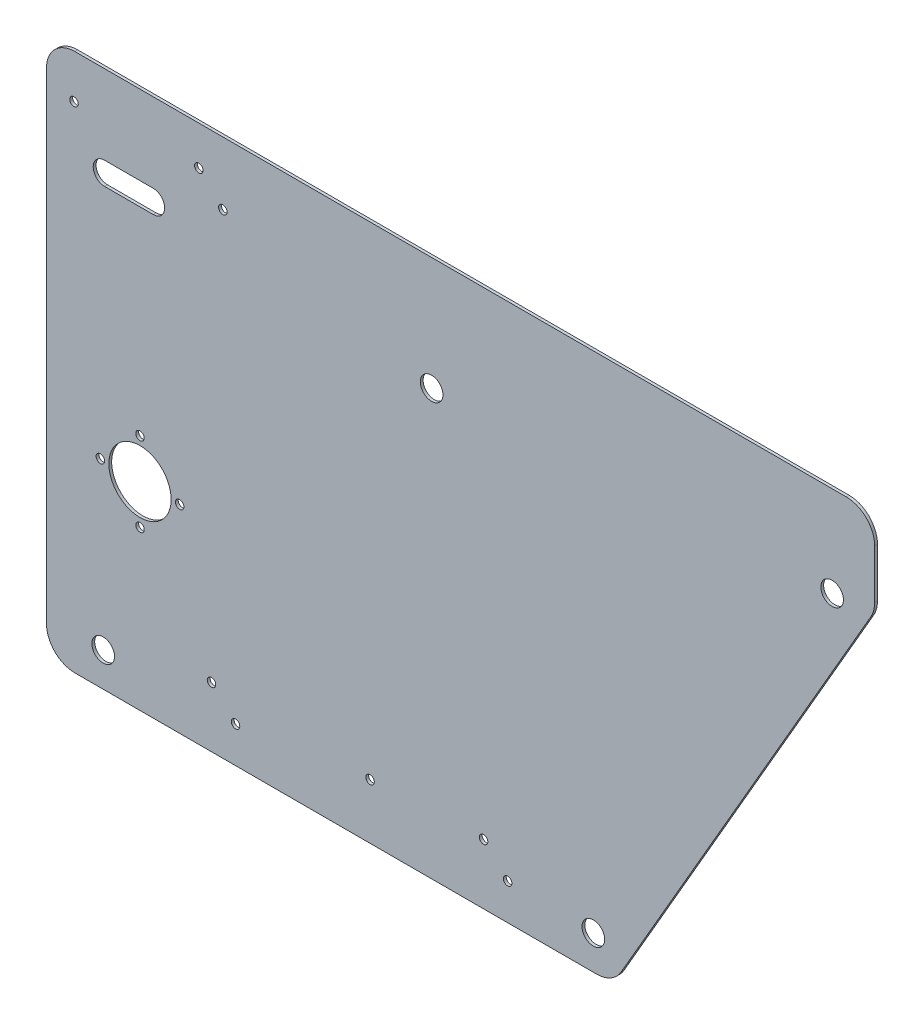
ISO-10303-21;
HEADER;
FILE_DESCRIPTION(('STEP AP214'),'2;1');
FILE_NAME('part.step','',(''),(''),'','','');
FILE_SCHEMA(('AUTOMOTIVE_DESIGN { 1 0 10303 214 1 1 1 1 }'));
ENDSEC;
DATA;
#1=APPLICATION_CONTEXT('core data for automotive mechanical design processes');
#2=APPLICATION_PROTOCOL_DEFINITION('international standard','automotive_design',2000,#1);
#3=PRODUCT_CONTEXT('',#1,'mechanical');
#4=PRODUCT('Part','Part','',(#3));
#5=PRODUCT_RELATED_PRODUCT_CATEGORY('part','',(#4));
#6=PRODUCT_DEFINITION_FORMATION('','',#4);
#7=PRODUCT_DEFINITION_CONTEXT('part definition',#1,'design');
#8=PRODUCT_DEFINITION('design','',#6,#7);
#9=PRODUCT_DEFINITION_SHAPE('','',#8);
#10=(LENGTH_UNIT() NAMED_UNIT(*) SI_UNIT(.MILLI.,.METRE.));
#11=(NAMED_UNIT(*) PLANE_ANGLE_UNIT() SI_UNIT($,.RADIAN.));
#12=(NAMED_UNIT(*) SI_UNIT($,.STERADIAN.) SOLID_ANGLE_UNIT());
#13=UNCERTAINTY_MEASURE_WITH_UNIT(LENGTH_MEASURE(1.E-05),#10,'distance_accuracy_value','');
#14=(GEOMETRIC_REPRESENTATION_CONTEXT(3) GLOBAL_UNCERTAINTY_ASSIGNED_CONTEXT((#13)) GLOBAL_UNIT_ASSIGNED_CONTEXT((#10,
#11,#12)) REPRESENTATION_CONTEXT('',''));
#15=CARTESIAN_POINT('',(0.,0.,0.));
#16=DIRECTION('',(0.,0.,1.));
#17=DIRECTION('',(1.,0.,0.));
#18=AXIS2_PLACEMENT_3D('',#15,#16,#17);
#19=CARTESIAN_POINT('',(0.,-80.0000000000001,1.));
#20=DIRECTION('',(0.,1.,0.));
#21=DIRECTION('',(0.,0.,1.));
#22=AXIS2_PLACEMENT_3D('',#19,#20,#21);
#23=PLANE('',#22);
#24=DIRECTION('',(1.,0.,0.));
#25=VECTOR('',#24,1.);
#26=CARTESIAN_POINT('',(0.,-80.0000000000001,0.));
#27=LINE('',#26,#25);
#28=CARTESIAN_POINT('',(-90.0000000000001,-80.0000000000001,0.));
#29=VERTEX_POINT('',#28);
#30=CARTESIAN_POINT('',(94.2264973081037,-80.0000000000001,0.));
#31=VERTEX_POINT('',#30);
#32=EDGE_CURVE('E234',#29,#31,#27,.T.);
#33=ORIENTED_EDGE('',*,*,#32,.T.);
#34=DIRECTION('',(0.,0.,-1.));
#35=VECTOR('',#34,1.);
#36=CARTESIAN_POINT('',(94.2264973081037,-80.0000000000001,1.));
#37=LINE('',#36,#35);
#38=CARTESIAN_POINT('',(94.2264973081037,-80.0000000000001,1.));
#39=VERTEX_POINT('',#38);
#40=EDGE_CURVE('E322',#31,#39,#37,.F.);
#41=ORIENTED_EDGE('',*,*,#40,.T.);
#42=DIRECTION('',(1.,0.,0.));
#43=VECTOR('',#42,1.);
#44=CARTESIAN_POINT('',(0.,-80.0000000000001,1.));
#45=LINE('',#44,#43);
#46=CARTESIAN_POINT('',(-90.0000000000001,-80.0000000000001,1.));
#47=VERTEX_POINT('',#46);
#48=EDGE_CURVE('E220',#47,#39,#45,.T.);
#49=ORIENTED_EDGE('',*,*,#48,.F.);
#50=DIRECTION('',(0.,0.,-1.));
#51=VECTOR('',#50,1.);
#52=CARTESIAN_POINT('',(-90.0000000000001,-80.0000000000001,0.));
#53=LINE('',#52,#51);
#54=EDGE_CURVE('E318',#47,#29,#53,.T.);
#55=ORIENTED_EDGE('',*,*,#54,.T.);
#56=EDGE_LOOP('',(#33,#41,#49,#55));
#57=FACE_BOUND('',#56,.T.);
#58=ADVANCED_FACE('F71',(#57),#23,.F.);
#59=CARTESIAN_POINT('',(109.641016151378,-63.3012701892212,1.));
#60=DIRECTION('',(0.866025403784442,-0.499999999999994,0.));
#61=DIRECTION('',(0.499999999999995,0.866025403784442,0.));
#62=AXIS2_PLACEMENT_3D('',#59,#60,#61);
#63=PLANE('',#62);
#64=DIRECTION('',(-0.499999999999995,-0.866025403784442,0.));
#65=VECTOR('',#64,1.);
#66=CARTESIAN_POINT('',(109.641016151378,-63.3012701892212,0.));
#67=LINE('',#66,#65);
#68=CARTESIAN_POINT('',(191.036297108183,77.6794919243112,0.));
#69=VERTEX_POINT('',#68);
#70=CARTESIAN_POINT('',(102.886751345948,-75.,0.));
#71=VERTEX_POINT('',#70);
#72=EDGE_CURVE('E238',#69,#71,#67,.T.);
#73=ORIENTED_EDGE('',*,*,#72,.F.);
#74=DIRECTION('',(0.,0.,-1.));
#75=VECTOR('',#74,1.);
#76=CARTESIAN_POINT('',(191.036297108183,77.6794919243112,1.));
#77=LINE('',#76,#75);
#78=CARTESIAN_POINT('',(191.036297108183,77.6794919243112,1.));
#79=VERTEX_POINT('',#78);
#80=EDGE_CURVE('E286',#69,#79,#77,.F.);
#81=ORIENTED_EDGE('',*,*,#80,.T.);
#82=DIRECTION('',(-0.499999999999995,-0.866025403784442,0.));
#83=VECTOR('',#82,1.);
#84=CARTESIAN_POINT('',(109.641016151378,-63.3012701892212,1.));
#85=LINE('',#84,#83);
#86=CARTESIAN_POINT('',(102.886751345948,-75.,1.));
#87=VERTEX_POINT('',#86);
#88=EDGE_CURVE('E224',#79,#87,#85,.T.);
#89=ORIENTED_EDGE('',*,*,#88,.T.);
#90=DIRECTION('',(0.,0.,-1.));
#91=VECTOR('',#90,1.);
#92=CARTESIAN_POINT('',(102.886751345948,-75.,0.));
#93=LINE('',#92,#91);
#94=EDGE_CURVE('E282',#87,#71,#93,.T.);
#95=ORIENTED_EDGE('',*,*,#94,.T.);
#96=EDGE_LOOP('',(#73,#81,#89,#95));
#97=FACE_BOUND('',#96,.T.);
#98=ADVANCED_FACE('F459',(#97),#63,.T.);
#99=CARTESIAN_POINT('',(-100.,0.,1.));
#100=DIRECTION('',(-1.,0.,0.));
#101=DIRECTION('',(0.,0.,1.));
#102=AXIS2_PLACEMENT_3D('',#99,#100,#101);
#103=PLANE('',#102);
#104=DIRECTION('',(0.,1.,0.));
#105=VECTOR('',#104,1.);
#106=CARTESIAN_POINT('',(-100.,0.,1.));
#107=LINE('',#106,#105);
#108=CARTESIAN_POINT('',(-100.,-70.0000000000001,1.));
#109=VERTEX_POINT('',#108);
#110=CARTESIAN_POINT('',(-100.,100.,1.));
#111=VERTEX_POINT('',#110);
#112=EDGE_CURVE('E229',#109,#111,#107,.T.);
#113=ORIENTED_EDGE('',*,*,#112,.T.);
#114=DIRECTION('',(0.,0.,-1.));
#115=VECTOR('',#114,1.);
#116=CARTESIAN_POINT('',(-100.,100.,1.));
#117=LINE('',#116,#115);
#118=CARTESIAN_POINT('',(-100.,100.,0.));
#119=VERTEX_POINT('',#118);
#120=EDGE_CURVE('E314',#111,#119,#117,.T.);
#121=ORIENTED_EDGE('',*,*,#120,.T.);
#122=DIRECTION('',(0.,1.,0.));
#123=VECTOR('',#122,1.);
#124=CARTESIAN_POINT('',(-100.,0.,0.));
#125=LINE('',#124,#123);
#126=CARTESIAN_POINT('',(-100.,-70.0000000000001,0.));
#127=VERTEX_POINT('',#126);
#128=EDGE_CURVE('E225',#127,#119,#125,.T.);
#129=ORIENTED_EDGE('',*,*,#128,.F.);
#130=DIRECTION('',(0.,0.,-1.));
#131=VECTOR('',#130,1.);
#132=CARTESIAN_POINT('',(-100.,-70.0000000000001,1.));
#133=LINE('',#132,#131);
#134=EDGE_CURVE('E311',#127,#109,#133,.F.);
#135=ORIENTED_EDGE('',*,*,#134,.T.);
#136=EDGE_LOOP('',(#113,#121,#129,#135));
#137=FACE_BOUND('',#136,.T.);
#138=ADVANCED_FACE('F475',(#137),#103,.T.);
#139=CARTESIAN_POINT('',(0.,0.,1.));
#140=DIRECTION('',(0.,0.,1.));
#141=DIRECTION('',(1.,0.,0.));
#142=AXIS2_PLACEMENT_3D('',#139,#140,#141);
#143=PLANE('',#142);
#144=CARTESIAN_POINT('',(-90.2956271146875,94.4999999999995,1.));
#145=DIRECTION('',(0.,0.,1.));
#146=DIRECTION('',(1.,0.,0.));
#147=AXIS2_PLACEMENT_3D('',#144,#145,#146);
#148=CIRCLE('',#147,1.5);
#149=CARTESIAN_POINT('',(-88.7956271146875,94.4999999999995,1.));
#150=VERTEX_POINT('',#149);
#151=EDGE_CURVE('E209',#150,#150,#148,.T.);
#152=ORIENTED_EDGE('',*,*,#151,.F.);
#153=EDGE_LOOP('',(#152));
#154=FACE_BOUND('',#153,.T.);
#155=CARTESIAN_POINT('',(-80.0000000000001,-68.0000000000001,1.));
#156=DIRECTION('',(0.,0.,1.));
#157=DIRECTION('',(1.,0.,0.));
#158=AXIS2_PLACEMENT_3D('',#155,#156,#157);
#159=CIRCLE('',#158,4.00000000000002);
#160=CARTESIAN_POINT('',(-76.,-68.0000000000001,1.));
#161=VERTEX_POINT('',#160);
#162=EDGE_CURVE('E181',#161,#161,#159,.T.);
#163=ORIENTED_EDGE('',*,*,#162,.F.);
#164=EDGE_LOOP('',(#163));
#165=FACE_BOUND('',#164,.T.);
#166=CARTESIAN_POINT('',(-53.0000000000001,-10.,1.));
#167=DIRECTION('',(0.,0.,1.));
#168=DIRECTION('',(1.,0.,0.));
#169=AXIS2_PLACEMENT_3D('',#166,#167,#168);
#170=CIRCLE('',#169,1.5);
#171=CARTESIAN_POINT('',(-51.5000000000001,-10.,1.));
#172=VERTEX_POINT('',#171);
#173=EDGE_CURVE('E883',#172,#172,#170,.T.);
#174=ORIENTED_EDGE('',*,*,#173,.F.);
#175=EDGE_LOOP('',(#174));
#176=FACE_BOUND('',#175,.T.);
#177=CARTESIAN_POINT('',(-67.0000000000001,3.99999999999995,1.));
#178=DIRECTION('',(0.,0.,1.));
#179=DIRECTION('',(1.,0.,0.));
#180=AXIS2_PLACEMENT_3D('',#177,#178,#179);
#181=CIRCLE('',#180,1.5);
#182=CARTESIAN_POINT('',(-65.5000000000001,3.99999999999995,1.));
#183=VERTEX_POINT('',#182);
#184=EDGE_CURVE('E879',#183,#183,#181,.T.);
#185=ORIENTED_EDGE('',*,*,#184,.F.);
#186=EDGE_LOOP('',(#185));
#187=FACE_BOUND('',#186,.T.);
#188=CARTESIAN_POINT('',(-81.0000000000001,-10.,1.));
#189=DIRECTION('',(0.,0.,1.));
#190=DIRECTION('',(1.,0.,0.));
#191=AXIS2_PLACEMENT_3D('',#188,#189,#190);
#192=CIRCLE('',#191,1.5);
#193=CARTESIAN_POINT('',(-79.5000000000001,-10.,1.));
#194=VERTEX_POINT('',#193);
#195=EDGE_CURVE('E871',#194,#194,#192,.T.);
#196=ORIENTED_EDGE('',*,*,#195,.F.);
#197=EDGE_LOOP('',(#196));
#198=FACE_BOUND('',#197,.T.);
#199=CARTESIAN_POINT('',(-79.5165867727854,77.9999999999999,1.));
#200=DIRECTION('',(0.,0.,1.));
#201=DIRECTION('',(1.,0.,0.));
#202=AXIS2_PLACEMENT_3D('',#199,#200,#201);
#203=CIRCLE('',#202,4.00000000000002);
#204=CARTESIAN_POINT('',(-79.5165867727854,82.,1.));
#205=VERTEX_POINT('',#204);
#206=CARTESIAN_POINT('',(-79.5165867727854,73.9999999999999,1.));
#207=VERTEX_POINT('',#206);
#208=EDGE_CURVE('E89',#205,#207,#203,.T.);
#209=ORIENTED_EDGE('',*,*,#208,.F.);
#210=DIRECTION('',(-1.,0.,0.));
#211=VECTOR('',#210,1.);
#212=CARTESIAN_POINT('',(-79.5165867727854,82.,1.));
#213=LINE('',#212,#211);
#214=CARTESIAN_POINT('',(-62.3003333743354,82.,1.));
#215=VERTEX_POINT('',#214);
#216=EDGE_CURVE('E184',#215,#205,#213,.T.);
#217=ORIENTED_EDGE('',*,*,#216,.F.);
#218=CARTESIAN_POINT('',(-62.3003333743354,77.9999999999999,1.));
#219=DIRECTION('',(0.,0.,1.));
#220=DIRECTION('',(1.,0.,0.));
#221=AXIS2_PLACEMENT_3D('',#218,#219,#220);
#222=CIRCLE('',#221,4.00000000000002);
#223=CARTESIAN_POINT('',(-62.3003333743354,73.9999999999999,1.));
#224=VERTEX_POINT('',#223);
#225=EDGE_CURVE('E191',#224,#215,#222,.T.);
#226=ORIENTED_EDGE('',*,*,#225,.F.);
#227=DIRECTION('',(1.,0.,0.));
#228=VECTOR('',#227,1.);
#229=CARTESIAN_POINT('',(-79.5165867727854,73.9999999999999,1.));
#230=LINE('',#229,#228);
#231=EDGE_CURVE('E197',#207,#224,#230,.T.);
#232=ORIENTED_EDGE('',*,*,#231,.F.);
#233=EDGE_LOOP('',(#209,#217,#226,#232));
#234=FACE_BOUND('',#233,.T.);
#235=CARTESIAN_POINT('',(-67.0000000000001,-10.,1.));
#236=DIRECTION('',(0.,0.,1.));
#237=DIRECTION('',(1.,0.,0.));
#238=AXIS2_PLACEMENT_3D('',#235,#236,#237);
#239=CIRCLE('',#238,11.);
#240=CARTESIAN_POINT('',(-56.0000000000001,-10.,1.));
#241=VERTEX_POINT('',#240);
#242=EDGE_CURVE('E199',#241,#241,#239,.T.);
#243=ORIENTED_EDGE('',*,*,#242,.F.);
#244=EDGE_LOOP('',(#243));
#245=FACE_BOUND('',#244,.T.);
#246=CARTESIAN_POINT('',(62.7960575902142,-67.2426406871193,1.));
#247=DIRECTION('',(0.,0.,1.));
#248=DIRECTION('',(1.,0.,0.));
#249=AXIS2_PLACEMENT_3D('',#246,#247,#248);
#250=CIRCLE('',#249,1.5);
#251=CARTESIAN_POINT('',(64.2960575902142,-67.2426406871193,1.));
#252=VERTEX_POINT('',#251);
#253=EDGE_CURVE('E204',#252,#252,#250,.T.);
#254=ORIENTED_EDGE('',*,*,#253,.F.);
#255=EDGE_LOOP('',(#254));
#256=FACE_BOUND('',#255,.T.);
#257=CARTESIAN_POINT('',(177.364936071409,77.9999999999999,1.));
#258=DIRECTION('',(0.,0.,1.));
#259=DIRECTION('',(1.,0.,0.));
#260=AXIS2_PLACEMENT_3D('',#257,#258,#259);
#261=CIRCLE('',#260,3.99999999999999);
#262=CARTESIAN_POINT('',(181.364936071409,77.9999999999999,1.));
#263=VERTEX_POINT('',#262);
#264=EDGE_CURVE('E219',#263,#263,#261,.T.);
#265=ORIENTED_EDGE('',*,*,#264,.F.);
#266=EDGE_LOOP('',(#265));
#267=FACE_BOUND('',#266,.T.);
#268=CARTESIAN_POINT('',(-46.2399918128805,96.2426406871192,1.));
#269=DIRECTION('',(0.,0.,1.));
#270=DIRECTION('',(1.,0.,0.));
#271=AXIS2_PLACEMENT_3D('',#268,#269,#270);
#272=CIRCLE('',#271,1.5);
#273=CARTESIAN_POINT('',(-44.7399918128805,96.2426406871192,1.));
#274=VERTEX_POINT('',#273);
#275=EDGE_CURVE('E213',#274,#274,#272,.T.);
#276=ORIENTED_EDGE('',*,*,#275,.F.);
#277=EDGE_LOOP('',(#276));
#278=FACE_BOUND('',#277,.T.);
#279=CARTESIAN_POINT('',(-37.754710438642,87.7573593128807,1.));
#280=DIRECTION('',(0.,0.,1.));
#281=DIRECTION('',(1.,0.,0.));
#282=AXIS2_PLACEMENT_3D('',#279,#280,#281);
#283=CIRCLE('',#282,1.5);
#284=CARTESIAN_POINT('',(-36.254710438642,87.7573593128807,1.));
#285=VERTEX_POINT('',#284);
#286=EDGE_CURVE('E859',#285,#285,#283,.T.);
#287=ORIENTED_EDGE('',*,*,#286,.F.);
#288=EDGE_LOOP('',(#287));
#289=FACE_BOUND('',#288,.T.);
#290=CARTESIAN_POINT('',(14.2258557289781,-60.5000000000005,1.));
#291=DIRECTION('',(0.,0.,1.));
#292=DIRECTION('',(1.,0.,0.));
#293=AXIS2_PLACEMENT_3D('',#290,#291,#292);
#294=CIRCLE('',#293,1.5);
#295=CARTESIAN_POINT('',(15.7258557289781,-60.5000000000005,1.));
#296=VERTEX_POINT('',#295);
#297=EDGE_CURVE('E851',#296,#296,#294,.T.);
#298=ORIENTED_EDGE('',*,*,#297,.F.);
#299=EDGE_LOOP('',(#298));
#300=FACE_BOUND('',#299,.T.);
#301=CARTESIAN_POINT('',(-41.7595083099343,-58.7573593128808,1.));
#302=DIRECTION('',(0.,0.,1.));
#303=DIRECTION('',(1.,0.,0.));
#304=AXIS2_PLACEMENT_3D('',#301,#302,#303);
#305=CIRCLE('',#304,1.50000000000001);
#306=CARTESIAN_POINT('',(-40.2595083099343,-58.7573593128808,1.));
#307=VERTEX_POINT('',#306);
#308=EDGE_CURVE('E834',#307,#307,#305,.T.);
#309=ORIENTED_EDGE('',*,*,#308,.F.);
#310=EDGE_LOOP('',(#309));
#311=FACE_BOUND('',#310,.T.);
#312=CARTESIAN_POINT('',(-33.2742269356957,-67.2426406871193,1.));
#313=DIRECTION('',(0.,0.,1.));
#314=DIRECTION('',(1.,0.,0.));
#315=AXIS2_PLACEMENT_3D('',#312,#313,#314);
#316=CIRCLE('',#315,1.5);
#317=CARTESIAN_POINT('',(-31.7742269356957,-67.2426406871193,1.));
#318=VERTEX_POINT('',#317);
#319=EDGE_CURVE('E850',#318,#318,#316,.T.);
#320=ORIENTED_EDGE('',*,*,#319,.F.);
#321=EDGE_LOOP('',(#320));
#322=FACE_BOUND('',#321,.T.);
#323=CARTESIAN_POINT('',(54.3107762159756,-58.7573593128808,1.));
#324=DIRECTION('',(0.,0.,1.));
#325=DIRECTION('',(1.,0.,0.));
#326=AXIS2_PLACEMENT_3D('',#323,#324,#325);
#327=CIRCLE('',#326,1.50000000000001);
#328=CARTESIAN_POINT('',(55.8107762159756,-58.7573593128808,1.));
#329=VERTEX_POINT('',#328);
#330=EDGE_CURVE('E856',#329,#329,#327,.T.);
#331=ORIENTED_EDGE('',*,*,#330,.F.);
#332=EDGE_LOOP('',(#331));
#333=FACE_BOUND('',#332,.T.);
#334=CARTESIAN_POINT('',(35.9572650330467,70.,1.));
#335=DIRECTION('',(0.,0.,1.));
#336=DIRECTION('',(1.,0.,0.));
#337=AXIS2_PLACEMENT_3D('',#334,#335,#336);
#338=CIRCLE('',#337,4.00000000000001);
#339=CARTESIAN_POINT('',(39.9572650330467,70.,1.));
#340=VERTEX_POINT('',#339);
#341=EDGE_CURVE('E872',#340,#340,#338,.T.);
#342=ORIENTED_EDGE('',*,*,#341,.F.);
#343=EDGE_LOOP('',(#342));
#344=FACE_BOUND('',#343,.T.);
#345=CARTESIAN_POINT('',(-67.0000000000001,-24.,1.));
#346=DIRECTION('',(0.,0.,1.));
#347=DIRECTION('',(1.,0.,0.));
#348=AXIS2_PLACEMENT_3D('',#345,#346,#347);
#349=CIRCLE('',#348,1.5);
#350=CARTESIAN_POINT('',(-65.5000000000001,-24.,1.));
#351=VERTEX_POINT('',#350);
#352=EDGE_CURVE('E868',#351,#351,#349,.T.);
#353=ORIENTED_EDGE('',*,*,#352,.F.);
#354=EDGE_LOOP('',(#353));
#355=FACE_BOUND('',#354,.T.);
#356=CARTESIAN_POINT('',(93.0717967697233,-68.0000000000001,1.));
#357=DIRECTION('',(0.,0.,1.));
#358=DIRECTION('',(1.,0.,0.));
#359=AXIS2_PLACEMENT_3D('',#356,#357,#358);
#360=CIRCLE('',#359,4.00000000000001);
#361=CARTESIAN_POINT('',(97.0717967697233,-68.0000000000001,1.));
#362=VERTEX_POINT('',#361);
#363=EDGE_CURVE('E214',#362,#362,#360,.T.);
#364=ORIENTED_EDGE('',*,*,#363,.F.);
#365=EDGE_LOOP('',(#364));
#366=FACE_BOUND('',#365,.T.);
#367=ORIENTED_EDGE('',*,*,#88,.F.);
#368=CARTESIAN_POINT('',(182.376043070339,82.6794919243112,1.));
#369=DIRECTION('',(0.,0.,1.));
#370=DIRECTION('',(1.,0.,0.));
#371=AXIS2_PLACEMENT_3D('',#368,#369,#370);
#372=CIRCLE('',#371,10.);
#373=CARTESIAN_POINT('',(192.376043070339,82.6794919243112,1.));
#374=VERTEX_POINT('',#373);
#375=EDGE_CURVE('E301',#79,#374,#372,.T.);
#376=ORIENTED_EDGE('',*,*,#375,.T.);
#377=DIRECTION('',(0.,1.,0.));
#378=VECTOR('',#377,1.);
#379=CARTESIAN_POINT('',(192.376043070339,80.,1.));
#380=LINE('',#379,#378);
#381=CARTESIAN_POINT('',(192.376043070339,100.,1.));
#382=VERTEX_POINT('',#381);
#383=EDGE_CURVE('E239',#374,#382,#380,.T.);
#384=ORIENTED_EDGE('',*,*,#383,.T.);
#385=CARTESIAN_POINT('',(182.376043070339,100.,1.));
#386=DIRECTION('',(0.,0.,1.));
#387=DIRECTION('',(1.,0.,0.));
#388=AXIS2_PLACEMENT_3D('',#385,#386,#387);
#389=CIRCLE('',#388,10.);
#390=CARTESIAN_POINT('',(182.376043070339,110.,1.));
#391=VERTEX_POINT('',#390);
#392=EDGE_CURVE('E298',#382,#391,#389,.T.);
#393=ORIENTED_EDGE('',*,*,#392,.T.);
#394=DIRECTION('',(1.,0.,0.));
#395=VECTOR('',#394,1.);
#396=CARTESIAN_POINT('',(-100.,110.,1.));
#397=LINE('',#396,#395);
#398=CARTESIAN_POINT('',(-90.0000000000001,110.,1.));
#399=VERTEX_POINT('',#398);
#400=EDGE_CURVE('E246',#399,#391,#397,.T.);
#401=ORIENTED_EDGE('',*,*,#400,.F.);
#402=CARTESIAN_POINT('',(-90.0000000000001,100.,1.));
#403=DIRECTION('',(0.,0.,1.));
#404=DIRECTION('',(1.,0.,0.));
#405=AXIS2_PLACEMENT_3D('',#402,#403,#404);
#406=CIRCLE('',#405,10.);
#407=EDGE_CURVE('E295',#399,#111,#406,.T.);
#408=ORIENTED_EDGE('',*,*,#407,.T.);
#409=ORIENTED_EDGE('',*,*,#112,.F.);
#410=CARTESIAN_POINT('',(-90.0000000000001,-70.0000000000001,1.));
#411=DIRECTION('',(0.,0.,1.));
#412=DIRECTION('',(1.,0.,0.));
#413=AXIS2_PLACEMENT_3D('',#410,#411,#412);
#414=CIRCLE('',#413,10.);
#415=EDGE_CURVE('E289',#109,#47,#414,.T.);
#416=ORIENTED_EDGE('',*,*,#415,.T.);
#417=ORIENTED_EDGE('',*,*,#48,.T.);
#418=CARTESIAN_POINT('',(94.2264973081037,-70.0000000000001,1.));
#419=DIRECTION('',(0.,0.,1.));
#420=DIRECTION('',(1.,0.,0.));
#421=AXIS2_PLACEMENT_3D('',#418,#419,#420);
#422=CIRCLE('',#421,10.);
#423=EDGE_CURVE('E292',#39,#87,#422,.T.);
#424=ORIENTED_EDGE('',*,*,#423,.T.);
#425=EDGE_LOOP('',(#367,#376,#384,#393,#401,#408,#409,#416,#417,#424));
#426=FACE_BOUND('',#425,.T.);
#427=ADVANCED_FACE('F195',(#154,#165,#176,#187,#198,#234,#245,#256,#267,#278,#289,#300,#311,
#322,#333,#344,#355,#366,#426),#143,.T.);
#428=CARTESIAN_POINT('',(0.,0.,0.));
#429=DIRECTION('',(0.,0.,1.));
#430=DIRECTION('',(1.,0.,0.));
#431=AXIS2_PLACEMENT_3D('',#428,#429,#430);
#432=PLANE('',#431);
#433=CARTESIAN_POINT('',(-90.2956271146875,94.4999999999995,0.));
#434=DIRECTION('',(0.,0.,1.));
#435=DIRECTION('',(1.,0.,0.));
#436=AXIS2_PLACEMENT_3D('',#433,#434,#435);
#437=CIRCLE('',#436,1.5);
#438=CARTESIAN_POINT('',(-88.7956271146875,94.4999999999995,0.));
#439=VERTEX_POINT('',#438);
#440=EDGE_CURVE('E75',#439,#439,#437,.T.);
#441=ORIENTED_EDGE('',*,*,#440,.T.);
#442=EDGE_LOOP('',(#441));
#443=FACE_BOUND('',#442,.T.);
#444=CARTESIAN_POINT('',(-80.0000000000001,-68.0000000000001,0.));
#445=DIRECTION('',(0.,0.,1.));
#446=DIRECTION('',(1.,0.,0.));
#447=AXIS2_PLACEMENT_3D('',#444,#445,#446);
#448=CIRCLE('',#447,4.00000000000002);
#449=CARTESIAN_POINT('',(-76.,-68.0000000000001,0.));
#450=VERTEX_POINT('',#449);
#451=EDGE_CURVE('E393',#450,#450,#448,.T.);
#452=ORIENTED_EDGE('',*,*,#451,.T.);
#453=EDGE_LOOP('',(#452));
#454=FACE_BOUND('',#453,.T.);
#455=CARTESIAN_POINT('',(-53.0000000000001,-10.,0.));
#456=DIRECTION('',(0.,0.,1.));
#457=DIRECTION('',(1.,0.,0.));
#458=AXIS2_PLACEMENT_3D('',#455,#456,#457);
#459=CIRCLE('',#458,1.5);
#460=CARTESIAN_POINT('',(-51.5000000000001,-10.,0.));
#461=VERTEX_POINT('',#460);
#462=EDGE_CURVE('E390',#461,#461,#459,.T.);
#463=ORIENTED_EDGE('',*,*,#462,.T.);
#464=EDGE_LOOP('',(#463));
#465=FACE_BOUND('',#464,.T.);
#466=CARTESIAN_POINT('',(-67.0000000000001,3.99999999999995,0.));
#467=DIRECTION('',(0.,0.,1.));
#468=DIRECTION('',(1.,0.,0.));
#469=AXIS2_PLACEMENT_3D('',#466,#467,#468);
#470=CIRCLE('',#469,1.5);
#471=CARTESIAN_POINT('',(-65.5000000000001,3.99999999999995,0.));
#472=VERTEX_POINT('',#471);
#473=EDGE_CURVE('E386',#472,#472,#470,.T.);
#474=ORIENTED_EDGE('',*,*,#473,.T.);
#475=EDGE_LOOP('',(#474));
#476=FACE_BOUND('',#475,.T.);
#477=CARTESIAN_POINT('',(-81.0000000000001,-10.,0.));
#478=DIRECTION('',(0.,0.,1.));
#479=DIRECTION('',(1.,0.,0.));
#480=AXIS2_PLACEMENT_3D('',#477,#478,#479);
#481=CIRCLE('',#480,1.5);
#482=CARTESIAN_POINT('',(-79.5000000000001,-10.,0.));
#483=VERTEX_POINT('',#482);
#484=EDGE_CURVE('E373',#483,#483,#481,.T.);
#485=ORIENTED_EDGE('',*,*,#484,.T.);
#486=EDGE_LOOP('',(#485));
#487=FACE_BOUND('',#486,.T.);
#488=DIRECTION('',(-1.,0.,0.));
#489=VECTOR('',#488,1.);
#490=CARTESIAN_POINT('',(0.,82.,0.));
#491=LINE('',#490,#489);
#492=CARTESIAN_POINT('',(-62.3003333743354,82.,0.));
#493=VERTEX_POINT('',#492);
#494=CARTESIAN_POINT('',(-79.5165867727854,82.,0.));
#495=VERTEX_POINT('',#494);
#496=EDGE_CURVE('E81',#493,#495,#491,.T.);
#497=ORIENTED_EDGE('',*,*,#496,.T.);
#498=CARTESIAN_POINT('',(-79.5165867727854,77.9999999999999,0.));
#499=DIRECTION('',(0.,0.,1.));
#500=DIRECTION('',(1.,0.,0.));
#501=AXIS2_PLACEMENT_3D('',#498,#499,#500);
#502=CIRCLE('',#501,4.00000000000002);
#503=CARTESIAN_POINT('',(-79.5165867727854,73.9999999999999,0.));
#504=VERTEX_POINT('',#503);
#505=EDGE_CURVE('E12',#495,#504,#502,.T.);
#506=ORIENTED_EDGE('',*,*,#505,.T.);
#507=DIRECTION('',(1.,0.,0.));
#508=VECTOR('',#507,1.);
#509=CARTESIAN_POINT('',(0.,73.9999999999999,0.));
#510=LINE('',#509,#508);
#511=CARTESIAN_POINT('',(-62.3003333743354,73.9999999999999,0.));
#512=VERTEX_POINT('',#511);
#513=EDGE_CURVE('E325',#504,#512,#510,.T.);
#514=ORIENTED_EDGE('',*,*,#513,.T.);
#515=CARTESIAN_POINT('',(-62.3003333743354,77.9999999999999,0.));
#516=DIRECTION('',(0.,0.,1.));
#517=DIRECTION('',(1.,0.,0.));
#518=AXIS2_PLACEMENT_3D('',#515,#516,#517);
#519=CIRCLE('',#518,4.00000000000002);
#520=EDGE_CURVE('E377',#512,#493,#519,.T.);
#521=ORIENTED_EDGE('',*,*,#520,.T.);
#522=EDGE_LOOP('',(#497,#506,#514,#521));
#523=FACE_BOUND('',#522,.T.);
#524=CARTESIAN_POINT('',(-67.0000000000001,-10.,0.));
#525=DIRECTION('',(0.,0.,1.));
#526=DIRECTION('',(1.,0.,0.));
#527=AXIS2_PLACEMENT_3D('',#524,#525,#526);
#528=CIRCLE('',#527,11.);
#529=CARTESIAN_POINT('',(-56.0000000000001,-10.,0.));
#530=VERTEX_POINT('',#529);
#531=EDGE_CURVE('E369',#530,#530,#528,.T.);
#532=ORIENTED_EDGE('',*,*,#531,.T.);
#533=EDGE_LOOP('',(#532));
#534=FACE_BOUND('',#533,.T.);
#535=CARTESIAN_POINT('',(62.7960575902142,-67.2426406871193,0.));
#536=DIRECTION('',(0.,0.,1.));
#537=DIRECTION('',(1.,0.,0.));
#538=AXIS2_PLACEMENT_3D('',#535,#536,#537);
#539=CIRCLE('',#538,1.5);
#540=CARTESIAN_POINT('',(64.2960575902142,-67.2426406871193,0.));
#541=VERTEX_POINT('',#540);
#542=EDGE_CURVE('E365',#541,#541,#539,.T.);
#543=ORIENTED_EDGE('',*,*,#542,.T.);
#544=EDGE_LOOP('',(#543));
#545=FACE_BOUND('',#544,.T.);
#546=CARTESIAN_POINT('',(177.364936071409,77.9999999999999,0.));
#547=DIRECTION('',(0.,0.,1.));
#548=DIRECTION('',(1.,0.,0.));
#549=AXIS2_PLACEMENT_3D('',#546,#547,#548);
#550=CIRCLE('',#549,3.99999999999999);
#551=CARTESIAN_POINT('',(181.364936071409,77.9999999999999,0.));
#552=VERTEX_POINT('',#551);
#553=EDGE_CURVE('E361',#552,#552,#550,.T.);
#554=ORIENTED_EDGE('',*,*,#553,.T.);
#555=EDGE_LOOP('',(#554));
#556=FACE_BOUND('',#555,.T.);
#557=CARTESIAN_POINT('',(-46.2399918128805,96.2426406871192,0.));
#558=DIRECTION('',(0.,0.,1.));
#559=DIRECTION('',(1.,0.,0.));
#560=AXIS2_PLACEMENT_3D('',#557,#558,#559);
#561=CIRCLE('',#560,1.5);
#562=CARTESIAN_POINT('',(-44.7399918128805,96.2426406871192,0.));
#563=VERTEX_POINT('',#562);
#564=EDGE_CURVE('E357',#563,#563,#561,.T.);
#565=ORIENTED_EDGE('',*,*,#564,.T.);
#566=EDGE_LOOP('',(#565));
#567=FACE_BOUND('',#566,.T.);
#568=CARTESIAN_POINT('',(-37.754710438642,87.7573593128807,0.));
#569=DIRECTION('',(0.,0.,1.));
#570=DIRECTION('',(1.,0.,0.));
#571=AXIS2_PLACEMENT_3D('',#568,#569,#570);
#572=CIRCLE('',#571,1.5);
#573=CARTESIAN_POINT('',(-36.254710438642,87.7573593128807,0.));
#574=VERTEX_POINT('',#573);
#575=EDGE_CURVE('E353',#574,#574,#572,.T.);
#576=ORIENTED_EDGE('',*,*,#575,.T.);
#577=EDGE_LOOP('',(#576));
#578=FACE_BOUND('',#577,.T.);
#579=CARTESIAN_POINT('',(14.2258557289781,-60.5000000000005,0.));
#580=DIRECTION('',(0.,0.,1.));
#581=DIRECTION('',(1.,0.,0.));
#582=AXIS2_PLACEMENT_3D('',#579,#580,#581);
#583=CIRCLE('',#582,1.5);
#584=CARTESIAN_POINT('',(15.7258557289781,-60.5000000000005,0.));
#585=VERTEX_POINT('',#584);
#586=EDGE_CURVE('E349',#585,#585,#583,.T.);
#587=ORIENTED_EDGE('',*,*,#586,.T.);
#588=EDGE_LOOP('',(#587));
#589=FACE_BOUND('',#588,.T.);
#590=CARTESIAN_POINT('',(-41.7595083099343,-58.7573593128808,0.));
#591=DIRECTION('',(0.,0.,1.));
#592=DIRECTION('',(1.,0.,0.));
#593=AXIS2_PLACEMENT_3D('',#590,#591,#592);
#594=CIRCLE('',#593,1.50000000000001);
#595=CARTESIAN_POINT('',(-40.2595083099343,-58.7573593128808,0.));
#596=VERTEX_POINT('',#595);
#597=EDGE_CURVE('E345',#596,#596,#594,.T.);
#598=ORIENTED_EDGE('',*,*,#597,.T.);
#599=EDGE_LOOP('',(#598));
#600=FACE_BOUND('',#599,.T.);
#601=CARTESIAN_POINT('',(-33.2742269356957,-67.2426406871193,0.));
#602=DIRECTION('',(0.,0.,1.));
#603=DIRECTION('',(1.,0.,0.));
#604=AXIS2_PLACEMENT_3D('',#601,#602,#603);
#605=CIRCLE('',#604,1.5);
#606=CARTESIAN_POINT('',(-31.7742269356957,-67.2426406871193,0.));
#607=VERTEX_POINT('',#606);
#608=EDGE_CURVE('E341',#607,#607,#605,.T.);
#609=ORIENTED_EDGE('',*,*,#608,.T.);
#610=EDGE_LOOP('',(#609));
#611=FACE_BOUND('',#610,.T.);
#612=CARTESIAN_POINT('',(54.3107762159756,-58.7573593128808,0.));
#613=DIRECTION('',(0.,0.,1.));
#614=DIRECTION('',(1.,0.,0.));
#615=AXIS2_PLACEMENT_3D('',#612,#613,#614);
#616=CIRCLE('',#615,1.50000000000001);
#617=CARTESIAN_POINT('',(55.8107762159756,-58.7573593128808,0.));
#618=VERTEX_POINT('',#617);
#619=EDGE_CURVE('E337',#618,#618,#616,.T.);
#620=ORIENTED_EDGE('',*,*,#619,.T.);
#621=EDGE_LOOP('',(#620));
#622=FACE_BOUND('',#621,.T.);
#623=CARTESIAN_POINT('',(35.9572650330467,70.,0.));
#624=DIRECTION('',(0.,0.,1.));
#625=DIRECTION('',(1.,0.,0.));
#626=AXIS2_PLACEMENT_3D('',#623,#624,#625);
#627=CIRCLE('',#626,4.00000000000001);
#628=CARTESIAN_POINT('',(39.9572650330467,70.,0.));
#629=VERTEX_POINT('',#628);
#630=EDGE_CURVE('E333',#629,#629,#627,.T.);
#631=ORIENTED_EDGE('',*,*,#630,.T.);
#632=EDGE_LOOP('',(#631));
#633=FACE_BOUND('',#632,.T.);
#634=CARTESIAN_POINT('',(-67.0000000000001,-24.,0.));
#635=DIRECTION('',(0.,0.,1.));
#636=DIRECTION('',(1.,0.,0.));
#637=AXIS2_PLACEMENT_3D('',#634,#635,#636);
#638=CIRCLE('',#637,1.5);
#639=CARTESIAN_POINT('',(-65.5000000000001,-24.,0.));
#640=VERTEX_POINT('',#639);
#641=EDGE_CURVE('E329',#640,#640,#638,.T.);
#642=ORIENTED_EDGE('',*,*,#641,.T.);
#643=EDGE_LOOP('',(#642));
#644=FACE_BOUND('',#643,.T.);
#645=CARTESIAN_POINT('',(93.0717967697233,-68.0000000000001,0.));
#646=DIRECTION('',(0.,0.,1.));
#647=DIRECTION('',(1.,0.,0.));
#648=AXIS2_PLACEMENT_3D('',#645,#646,#647);
#649=CIRCLE('',#648,4.00000000000001);
#650=CARTESIAN_POINT('',(97.0717967697233,-68.0000000000001,0.));
#651=VERTEX_POINT('',#650);
#652=EDGE_CURVE('E218',#651,#651,#649,.T.);
#653=ORIENTED_EDGE('',*,*,#652,.T.);
#654=EDGE_LOOP('',(#653));
#655=FACE_BOUND('',#654,.T.);
#656=DIRECTION('',(0.,1.,0.));
#657=VECTOR('',#656,1.);
#658=CARTESIAN_POINT('',(192.376043070339,80.,0.));
#659=LINE('',#658,#657);
#660=CARTESIAN_POINT('',(192.376043070339,82.6794919243112,0.));
#661=VERTEX_POINT('',#660);
#662=CARTESIAN_POINT('',(192.376043070339,100.,0.));
#663=VERTEX_POINT('',#662);
#664=EDGE_CURVE('E250',#661,#663,#659,.T.);
#665=ORIENTED_EDGE('',*,*,#664,.F.);
#666=CARTESIAN_POINT('',(182.376043070339,82.6794919243112,0.));
#667=DIRECTION('',(0.,0.,1.));
#668=DIRECTION('',(1.,0.,0.));
#669=AXIS2_PLACEMENT_3D('',#666,#667,#668);
#670=CIRCLE('',#669,10.);
#671=EDGE_CURVE('E279',#661,#69,#670,.F.);
#672=ORIENTED_EDGE('',*,*,#671,.T.);
#673=ORIENTED_EDGE('',*,*,#72,.T.);
#674=CARTESIAN_POINT('',(94.2264973081037,-70.0000000000001,0.));
#675=DIRECTION('',(0.,0.,1.));
#676=DIRECTION('',(1.,0.,0.));
#677=AXIS2_PLACEMENT_3D('',#674,#675,#676);
#678=CIRCLE('',#677,10.);
#679=EDGE_CURVE('E270',#71,#31,#678,.F.);
#680=ORIENTED_EDGE('',*,*,#679,.T.);
#681=ORIENTED_EDGE('',*,*,#32,.F.);
#682=CARTESIAN_POINT('',(-90.0000000000001,-70.0000000000001,0.));
#683=DIRECTION('',(0.,0.,1.));
#684=DIRECTION('',(1.,0.,0.));
#685=AXIS2_PLACEMENT_3D('',#682,#683,#684);
#686=CIRCLE('',#685,10.);
#687=EDGE_CURVE('E267',#29,#127,#686,.F.);
#688=ORIENTED_EDGE('',*,*,#687,.T.);
#689=ORIENTED_EDGE('',*,*,#128,.T.);
#690=CARTESIAN_POINT('',(-90.0000000000001,100.,0.));
#691=DIRECTION('',(0.,0.,1.));
#692=DIRECTION('',(1.,0.,0.));
#693=AXIS2_PLACEMENT_3D('',#690,#691,#692);
#694=CIRCLE('',#693,10.);
#695=CARTESIAN_POINT('',(-90.0000000000001,110.,0.));
#696=VERTEX_POINT('',#695);
#697=EDGE_CURVE('E273',#119,#696,#694,.F.);
#698=ORIENTED_EDGE('',*,*,#697,.T.);
#699=DIRECTION('',(1.,0.,0.));
#700=VECTOR('',#699,1.);
#701=CARTESIAN_POINT('',(-100.,110.,0.));
#702=LINE('',#701,#700);
#703=CARTESIAN_POINT('',(182.376043070339,110.,0.));
#704=VERTEX_POINT('',#703);
#705=EDGE_CURVE('E254',#696,#704,#702,.T.);
#706=ORIENTED_EDGE('',*,*,#705,.T.);
#707=CARTESIAN_POINT('',(182.376043070339,100.,0.));
#708=DIRECTION('',(0.,0.,1.));
#709=DIRECTION('',(1.,0.,0.));
#710=AXIS2_PLACEMENT_3D('',#707,#708,#709);
#711=CIRCLE('',#710,10.);
#712=EDGE_CURVE('E276',#704,#663,#711,.F.);
#713=ORIENTED_EDGE('',*,*,#712,.T.);
#714=EDGE_LOOP('',(#665,#672,#673,#680,#681,#688,#689,#698,#706,#713));
#715=FACE_BOUND('',#714,.T.);
#716=ADVANCED_FACE('F402',(#443,#454,#465,#476,#487,#523,#534,#545,#556,#567,#578,#589,#600,
#611,#622,#633,#644,#655,#715),#432,.F.);
#717=CARTESIAN_POINT('',(-100.,110.,1.));
#718=DIRECTION('',(0.,1.,0.));
#719=DIRECTION('',(0.,0.,1.));
#720=AXIS2_PLACEMENT_3D('',#717,#718,#719);
#721=PLANE('',#720);
#722=ORIENTED_EDGE('',*,*,#400,.T.);
#723=DIRECTION('',(0.,0.,-1.));
#724=VECTOR('',#723,1.);
#725=CARTESIAN_POINT('',(182.376043070339,110.,0.));
#726=LINE('',#725,#724);
#727=EDGE_CURVE('E307',#391,#704,#726,.T.);
#728=ORIENTED_EDGE('',*,*,#727,.T.);
#729=ORIENTED_EDGE('',*,*,#705,.F.);
#730=DIRECTION('',(0.,0.,-1.));
#731=VECTOR('',#730,1.);
#732=CARTESIAN_POINT('',(-90.0000000000001,110.,1.));
#733=LINE('',#732,#731);
#734=EDGE_CURVE('E304',#696,#399,#733,.F.);
#735=ORIENTED_EDGE('',*,*,#734,.T.);
#736=EDGE_LOOP('',(#722,#728,#729,#735));
#737=FACE_BOUND('',#736,.T.);
#738=ADVANCED_FACE('F417',(#737),#721,.T.);
#739=CARTESIAN_POINT('',(192.376043070339,80.,1.));
#740=DIRECTION('',(-1.,0.,0.));
#741=DIRECTION('',(0.,0.,1.));
#742=AXIS2_PLACEMENT_3D('',#739,#740,#741);
#743=PLANE('',#742);
#744=ORIENTED_EDGE('',*,*,#383,.F.);
#745=DIRECTION('',(0.,0.,-1.));
#746=VECTOR('',#745,1.);
#747=CARTESIAN_POINT('',(192.376043070339,82.6794919243112,0.));
#748=LINE('',#747,#746);
#749=EDGE_CURVE('E263',#374,#661,#748,.T.);
#750=ORIENTED_EDGE('',*,*,#749,.T.);
#751=ORIENTED_EDGE('',*,*,#664,.T.);
#752=DIRECTION('',(0.,0.,-1.));
#753=VECTOR('',#752,1.);
#754=CARTESIAN_POINT('',(192.376043070339,100.,1.));
#755=LINE('',#754,#753);
#756=EDGE_CURVE('E233',#663,#382,#755,.F.);
#757=ORIENTED_EDGE('',*,*,#756,.T.);
#758=EDGE_LOOP('',(#744,#750,#751,#757));
#759=FACE_BOUND('',#758,.T.);
#760=ADVANCED_FACE('F419',(#759),#743,.F.);
#761=CARTESIAN_POINT('',(182.376043070339,82.6794919243112,1.));
#762=DIRECTION('',(0.,0.,1.));
#763=DIRECTION('',(1.,0.,0.));
#764=AXIS2_PLACEMENT_3D('',#761,#762,#763);
#765=CYLINDRICAL_SURFACE('',#764,10.);
#766=ORIENTED_EDGE('',*,*,#375,.F.);
#767=ORIENTED_EDGE('',*,*,#80,.F.);
#768=ORIENTED_EDGE('',*,*,#671,.F.);
#769=ORIENTED_EDGE('',*,*,#749,.F.);
#770=EDGE_LOOP('',(#766,#767,#768,#769));
#771=FACE_BOUND('',#770,.T.);
#772=ADVANCED_FACE('F426',(#771),#765,.T.);
#773=CARTESIAN_POINT('',(182.376043070339,100.,1.));
#774=DIRECTION('',(0.,0.,1.));
#775=DIRECTION('',(1.,0.,0.));
#776=AXIS2_PLACEMENT_3D('',#773,#774,#775);
#777=CYLINDRICAL_SURFACE('',#776,10.);
#778=ORIENTED_EDGE('',*,*,#392,.F.);
#779=ORIENTED_EDGE('',*,*,#756,.F.);
#780=ORIENTED_EDGE('',*,*,#712,.F.);
#781=ORIENTED_EDGE('',*,*,#727,.F.);
#782=EDGE_LOOP('',(#778,#779,#780,#781));
#783=FACE_BOUND('',#782,.T.);
#784=ADVANCED_FACE('F434',(#783),#777,.T.);
#785=CARTESIAN_POINT('',(-90.0000000000001,100.,1.));
#786=DIRECTION('',(0.,0.,-1.));
#787=DIRECTION('',(-1.,0.,0.));
#788=AXIS2_PLACEMENT_3D('',#785,#786,#787);
#789=CYLINDRICAL_SURFACE('',#788,10.);
#790=ORIENTED_EDGE('',*,*,#407,.F.);
#791=ORIENTED_EDGE('',*,*,#734,.F.);
#792=ORIENTED_EDGE('',*,*,#697,.F.);
#793=ORIENTED_EDGE('',*,*,#120,.F.);
#794=EDGE_LOOP('',(#790,#791,#792,#793));
#795=FACE_BOUND('',#794,.T.);
#796=ADVANCED_FACE('F438',(#795),#789,.T.);
#797=CARTESIAN_POINT('',(94.2264973081037,-70.0000000000001,1.));
#798=DIRECTION('',(0.,0.,1.));
#799=DIRECTION('',(1.,0.,0.));
#800=AXIS2_PLACEMENT_3D('',#797,#798,#799);
#801=CYLINDRICAL_SURFACE('',#800,10.);
#802=ORIENTED_EDGE('',*,*,#423,.F.);
#803=ORIENTED_EDGE('',*,*,#40,.F.);
#804=ORIENTED_EDGE('',*,*,#679,.F.);
#805=ORIENTED_EDGE('',*,*,#94,.F.);
#806=EDGE_LOOP('',(#802,#803,#804,#805));
#807=FACE_BOUND('',#806,.T.);
#808=ADVANCED_FACE('F441',(#807),#801,.T.);
#809=CARTESIAN_POINT('',(-90.0000000000001,-70.0000000000001,1.));
#810=DIRECTION('',(0.,0.,1.));
#811=DIRECTION('',(1.,0.,0.));
#812=AXIS2_PLACEMENT_3D('',#809,#810,#811);
#813=CYLINDRICAL_SURFACE('',#812,10.);
#814=ORIENTED_EDGE('',*,*,#415,.F.);
#815=ORIENTED_EDGE('',*,*,#134,.F.);
#816=ORIENTED_EDGE('',*,*,#687,.F.);
#817=ORIENTED_EDGE('',*,*,#54,.F.);
#818=EDGE_LOOP('',(#814,#815,#816,#817));
#819=FACE_BOUND('',#818,.T.);
#820=ADVANCED_FACE('F73',(#819),#813,.T.);
#821=CARTESIAN_POINT('',(93.0717967697233,-68.0000000000001,-2.));
#822=DIRECTION('',(0.,0.,1.));
#823=DIRECTION('',(1.,0.,0.));
#824=AXIS2_PLACEMENT_3D('',#821,#822,#823);
#825=CYLINDRICAL_SURFACE('',#824,4.00000000000001);
#826=ORIENTED_EDGE('',*,*,#363,.T.);
#827=EDGE_LOOP('',(#826));
#828=FACE_BOUND('',#827,.T.);
#829=ORIENTED_EDGE('',*,*,#652,.F.);
#830=EDGE_LOOP('',(#829));
#831=FACE_BOUND('',#830,.T.);
#832=ADVANCED_FACE('F448',(#828,#831),#825,.F.);
#833=CARTESIAN_POINT('',(-67.0000000000001,-24.,-2.));
#834=DIRECTION('',(0.,0.,1.));
#835=DIRECTION('',(1.,0.,0.));
#836=AXIS2_PLACEMENT_3D('',#833,#834,#835);
#837=CYLINDRICAL_SURFACE('',#836,1.5);
#838=ORIENTED_EDGE('',*,*,#352,.T.);
#839=EDGE_LOOP('',(#838));
#840=FACE_BOUND('',#839,.T.);
#841=ORIENTED_EDGE('',*,*,#641,.F.);
#842=EDGE_LOOP('',(#841));
#843=FACE_BOUND('',#842,.T.);
#844=ADVANCED_FACE('F493',(#840,#843),#837,.F.);
#845=CARTESIAN_POINT('',(35.9572650330467,70.,-2.));
#846=DIRECTION('',(0.,0.,1.));
#847=DIRECTION('',(1.,0.,0.));
#848=AXIS2_PLACEMENT_3D('',#845,#846,#847);
#849=CYLINDRICAL_SURFACE('',#848,4.00000000000001);
#850=ORIENTED_EDGE('',*,*,#341,.T.);
#851=EDGE_LOOP('',(#850));
#852=FACE_BOUND('',#851,.T.);
#853=ORIENTED_EDGE('',*,*,#630,.F.);
#854=EDGE_LOOP('',(#853));
#855=FACE_BOUND('',#854,.T.);
#856=ADVANCED_FACE('F498',(#852,#855),#849,.F.);
#857=CARTESIAN_POINT('',(54.3107762159756,-58.7573593128808,-2.));
#858=DIRECTION('',(0.,0.,1.));
#859=DIRECTION('',(1.,0.,0.));
#860=AXIS2_PLACEMENT_3D('',#857,#858,#859);
#861=CYLINDRICAL_SURFACE('',#860,1.50000000000001);
#862=ORIENTED_EDGE('',*,*,#330,.T.);
#863=EDGE_LOOP('',(#862));
#864=FACE_BOUND('',#863,.T.);
#865=ORIENTED_EDGE('',*,*,#619,.F.);
#866=EDGE_LOOP('',(#865));
#867=FACE_BOUND('',#866,.T.);
#868=ADVANCED_FACE('F509',(#864,#867),#861,.F.);
#869=CARTESIAN_POINT('',(-33.2742269356957,-67.2426406871193,-2.));
#870=DIRECTION('',(0.,0.,1.));
#871=DIRECTION('',(1.,0.,0.));
#872=AXIS2_PLACEMENT_3D('',#869,#870,#871);
#873=CYLINDRICAL_SURFACE('',#872,1.5);
#874=ORIENTED_EDGE('',*,*,#319,.T.);
#875=EDGE_LOOP('',(#874));
#876=FACE_BOUND('',#875,.T.);
#877=ORIENTED_EDGE('',*,*,#608,.F.);
#878=EDGE_LOOP('',(#877));
#879=FACE_BOUND('',#878,.T.);
#880=ADVANCED_FACE('F520',(#876,#879),#873,.F.);
#881=CARTESIAN_POINT('',(-41.7595083099343,-58.7573593128808,-2.));
#882=DIRECTION('',(0.,0.,1.));
#883=DIRECTION('',(1.,0.,0.));
#884=AXIS2_PLACEMENT_3D('',#881,#882,#883);
#885=CYLINDRICAL_SURFACE('',#884,1.50000000000001);
#886=ORIENTED_EDGE('',*,*,#308,.T.);
#887=EDGE_LOOP('',(#886));
#888=FACE_BOUND('',#887,.T.);
#889=ORIENTED_EDGE('',*,*,#597,.F.);
#890=EDGE_LOOP('',(#889));
#891=FACE_BOUND('',#890,.T.);
#892=ADVANCED_FACE('F524',(#888,#891),#885,.F.);
#893=CARTESIAN_POINT('',(14.2258557289781,-60.5000000000005,-2.));
#894=DIRECTION('',(0.,0.,1.));
#895=DIRECTION('',(1.,0.,0.));
#896=AXIS2_PLACEMENT_3D('',#893,#894,#895);
#897=CYLINDRICAL_SURFACE('',#896,1.5);
#898=ORIENTED_EDGE('',*,*,#297,.T.);
#899=EDGE_LOOP('',(#898));
#900=FACE_BOUND('',#899,.T.);
#901=ORIENTED_EDGE('',*,*,#586,.F.);
#902=EDGE_LOOP('',(#901));
#903=FACE_BOUND('',#902,.T.);
#904=ADVANCED_FACE('F659',(#900,#903),#897,.F.);
#905=CARTESIAN_POINT('',(-37.754710438642,87.7573593128807,-2.));
#906=DIRECTION('',(0.,0.,1.));
#907=DIRECTION('',(1.,0.,0.));
#908=AXIS2_PLACEMENT_3D('',#905,#906,#907);
#909=CYLINDRICAL_SURFACE('',#908,1.5);
#910=ORIENTED_EDGE('',*,*,#286,.T.);
#911=EDGE_LOOP('',(#910));
#912=FACE_BOUND('',#911,.T.);
#913=ORIENTED_EDGE('',*,*,#575,.F.);
#914=EDGE_LOOP('',(#913));
#915=FACE_BOUND('',#914,.T.);
#916=ADVANCED_FACE('F650',(#912,#915),#909,.F.);
#917=CARTESIAN_POINT('',(-46.2399918128805,96.2426406871192,-2.));
#918=DIRECTION('',(0.,0.,1.));
#919=DIRECTION('',(1.,0.,0.));
#920=AXIS2_PLACEMENT_3D('',#917,#918,#919);
#921=CYLINDRICAL_SURFACE('',#920,1.5);
#922=ORIENTED_EDGE('',*,*,#275,.T.);
#923=EDGE_LOOP('',(#922));
#924=FACE_BOUND('',#923,.T.);
#925=ORIENTED_EDGE('',*,*,#564,.F.);
#926=EDGE_LOOP('',(#925));
#927=FACE_BOUND('',#926,.T.);
#928=ADVANCED_FACE('F515',(#924,#927),#921,.F.);
#929=CARTESIAN_POINT('',(177.364936071409,77.9999999999999,-2.));
#930=DIRECTION('',(0.,0.,1.));
#931=DIRECTION('',(1.,0.,0.));
#932=AXIS2_PLACEMENT_3D('',#929,#930,#931);
#933=CYLINDRICAL_SURFACE('',#932,3.99999999999999);
#934=ORIENTED_EDGE('',*,*,#264,.T.);
#935=EDGE_LOOP('',(#934));
#936=FACE_BOUND('',#935,.T.);
#937=ORIENTED_EDGE('',*,*,#553,.F.);
#938=EDGE_LOOP('',(#937));
#939=FACE_BOUND('',#938,.T.);
#940=ADVANCED_FACE('F538',(#936,#939),#933,.F.);
#941=CARTESIAN_POINT('',(62.7960575902142,-67.2426406871193,-2.));
#942=DIRECTION('',(0.,0.,1.));
#943=DIRECTION('',(1.,0.,0.));
#944=AXIS2_PLACEMENT_3D('',#941,#942,#943);
#945=CYLINDRICAL_SURFACE('',#944,1.5);
#946=ORIENTED_EDGE('',*,*,#253,.T.);
#947=EDGE_LOOP('',(#946));
#948=FACE_BOUND('',#947,.T.);
#949=ORIENTED_EDGE('',*,*,#542,.F.);
#950=EDGE_LOOP('',(#949));
#951=FACE_BOUND('',#950,.T.);
#952=ADVANCED_FACE('F541',(#948,#951),#945,.F.);
#953=CARTESIAN_POINT('',(-67.0000000000001,-10.,-2.));
#954=DIRECTION('',(0.,0.,1.));
#955=DIRECTION('',(1.,0.,0.));
#956=AXIS2_PLACEMENT_3D('',#953,#954,#955);
#957=CYLINDRICAL_SURFACE('',#956,11.);
#958=ORIENTED_EDGE('',*,*,#242,.T.);
#959=EDGE_LOOP('',(#958));
#960=FACE_BOUND('',#959,.T.);
#961=ORIENTED_EDGE('',*,*,#531,.F.);
#962=EDGE_LOOP('',(#961));
#963=FACE_BOUND('',#962,.T.);
#964=ADVANCED_FACE('F545',(#960,#963),#957,.F.);
#965=CARTESIAN_POINT('',(-79.5165867727854,77.9999999999999,-2.));
#966=DIRECTION('',(0.,0.,1.));
#967=DIRECTION('',(1.,0.,0.));
#968=AXIS2_PLACEMENT_3D('',#965,#966,#967);
#969=CYLINDRICAL_SURFACE('',#968,4.00000000000002);
#970=DIRECTION('',(0.,0.,1.));
#971=VECTOR('',#970,1.);
#972=CARTESIAN_POINT('',(-79.5165867727854,82.,-2.));
#973=LINE('',#972,#971);
#974=EDGE_CURVE('E174',#495,#205,#973,.T.);
#975=ORIENTED_EDGE('',*,*,#974,.T.);
#976=ORIENTED_EDGE('',*,*,#208,.T.);
#977=DIRECTION('',(0.,0.,1.));
#978=VECTOR('',#977,1.);
#979=CARTESIAN_POINT('',(-79.5165867727854,73.9999999999999,-2.));
#980=LINE('',#979,#978);
#981=EDGE_CURVE('E192',#504,#207,#980,.T.);
#982=ORIENTED_EDGE('',*,*,#981,.F.);
#983=ORIENTED_EDGE('',*,*,#505,.F.);
#984=EDGE_LOOP('',(#975,#976,#982,#983));
#985=FACE_BOUND('',#984,.T.);
#986=ADVANCED_FACE('F176',(#985),#969,.F.);
#987=CARTESIAN_POINT('',(-79.5165867727854,82.,-2.));
#988=DIRECTION('',(0.,1.,0.));
#989=DIRECTION('',(0.,0.,1.));
#990=AXIS2_PLACEMENT_3D('',#987,#988,#989);
#991=PLANE('',#990);
#992=DIRECTION('',(0.,0.,1.));
#993=VECTOR('',#992,1.);
#994=CARTESIAN_POINT('',(-62.3003333743354,82.,-2.));
#995=LINE('',#994,#993);
#996=EDGE_CURVE('E180',#493,#215,#995,.T.);
#997=ORIENTED_EDGE('',*,*,#996,.T.);
#998=ORIENTED_EDGE('',*,*,#216,.T.);
#999=ORIENTED_EDGE('',*,*,#974,.F.);
#1000=ORIENTED_EDGE('',*,*,#496,.F.);
#1001=EDGE_LOOP('',(#997,#998,#999,#1000));
#1002=FACE_BOUND('',#1001,.T.);
#1003=ADVANCED_FACE('F185',(#1002),#991,.F.);
#1004=CARTESIAN_POINT('',(-62.3003333743354,77.9999999999999,-2.));
#1005=DIRECTION('',(0.,0.,1.));
#1006=DIRECTION('',(1.,0.,0.));
#1007=AXIS2_PLACEMENT_3D('',#1004,#1005,#1006);
#1008=CYLINDRICAL_SURFACE('',#1007,4.00000000000002);
#1009=DIRECTION('',(0.,0.,1.));
#1010=VECTOR('',#1009,1.);
#1011=CARTESIAN_POINT('',(-62.3003333743354,73.9999999999999,-2.));
#1012=LINE('',#1011,#1010);
#1013=EDGE_CURVE('E97',#512,#224,#1012,.T.);
#1014=ORIENTED_EDGE('',*,*,#1013,.T.);
#1015=ORIENTED_EDGE('',*,*,#225,.T.);
#1016=ORIENTED_EDGE('',*,*,#996,.F.);
#1017=ORIENTED_EDGE('',*,*,#520,.F.);
#1018=EDGE_LOOP('',(#1014,#1015,#1016,#1017));
#1019=FACE_BOUND('',#1018,.T.);
#1020=ADVANCED_FACE('F554',(#1019),#1008,.F.);
#1021=CARTESIAN_POINT('',(-79.5165867727854,73.9999999999999,-2.));
#1022=DIRECTION('',(0.,-1.,0.));
#1023=DIRECTION('',(0.,0.,-1.));
#1024=AXIS2_PLACEMENT_3D('',#1021,#1022,#1023);
#1025=PLANE('',#1024);
#1026=ORIENTED_EDGE('',*,*,#981,.T.);
#1027=ORIENTED_EDGE('',*,*,#231,.T.);
#1028=ORIENTED_EDGE('',*,*,#1013,.F.);
#1029=ORIENTED_EDGE('',*,*,#513,.F.);
#1030=EDGE_LOOP('',(#1026,#1027,#1028,#1029));
#1031=FACE_BOUND('',#1030,.T.);
#1032=ADVANCED_FACE('F532',(#1031),#1025,.F.);
#1033=CARTESIAN_POINT('',(-81.0000000000001,-10.,-2.));
#1034=DIRECTION('',(0.,0.,1.));
#1035=DIRECTION('',(1.,0.,0.));
#1036=AXIS2_PLACEMENT_3D('',#1033,#1034,#1035);
#1037=CYLINDRICAL_SURFACE('',#1036,1.5);
#1038=ORIENTED_EDGE('',*,*,#195,.T.);
#1039=EDGE_LOOP('',(#1038));
#1040=FACE_BOUND('',#1039,.T.);
#1041=ORIENTED_EDGE('',*,*,#484,.F.);
#1042=EDGE_LOOP('',(#1041));
#1043=FACE_BOUND('',#1042,.T.);
#1044=ADVANCED_FACE('F529',(#1040,#1043),#1037,.F.);
#1045=CARTESIAN_POINT('',(-67.0000000000001,3.99999999999995,-2.));
#1046=DIRECTION('',(0.,0.,1.));
#1047=DIRECTION('',(1.,0.,0.));
#1048=AXIS2_PLACEMENT_3D('',#1045,#1046,#1047);
#1049=CYLINDRICAL_SURFACE('',#1048,1.5);
#1050=ORIENTED_EDGE('',*,*,#184,.T.);
#1051=EDGE_LOOP('',(#1050));
#1052=FACE_BOUND('',#1051,.T.);
#1053=ORIENTED_EDGE('',*,*,#473,.F.);
#1054=EDGE_LOOP('',(#1053));
#1055=FACE_BOUND('',#1054,.T.);
#1056=ADVANCED_FACE('F526',(#1052,#1055),#1049,.F.);
#1057=CARTESIAN_POINT('',(-53.0000000000001,-10.,-2.));
#1058=DIRECTION('',(0.,0.,1.));
#1059=DIRECTION('',(1.,0.,0.));
#1060=AXIS2_PLACEMENT_3D('',#1057,#1058,#1059);
#1061=CYLINDRICAL_SURFACE('',#1060,1.5);
#1062=ORIENTED_EDGE('',*,*,#173,.T.);
#1063=EDGE_LOOP('',(#1062));
#1064=FACE_BOUND('',#1063,.T.);
#1065=ORIENTED_EDGE('',*,*,#462,.F.);
#1066=EDGE_LOOP('',(#1065));
#1067=FACE_BOUND('',#1066,.T.);
#1068=ADVANCED_FACE('F412',(#1064,#1067),#1061,.F.);
#1069=CARTESIAN_POINT('',(-80.0000000000001,-68.0000000000001,-2.));
#1070=DIRECTION('',(0.,0.,1.));
#1071=DIRECTION('',(1.,0.,0.));
#1072=AXIS2_PLACEMENT_3D('',#1069,#1070,#1071);
#1073=CYLINDRICAL_SURFACE('',#1072,4.00000000000002);
#1074=ORIENTED_EDGE('',*,*,#162,.T.);
#1075=EDGE_LOOP('',(#1074));
#1076=FACE_BOUND('',#1075,.T.);
#1077=ORIENTED_EDGE('',*,*,#451,.F.);
#1078=EDGE_LOOP('',(#1077));
#1079=FACE_BOUND('',#1078,.T.);
#1080=ADVANCED_FACE('F406',(#1076,#1079),#1073,.F.);
#1081=CARTESIAN_POINT('',(-90.2956271146875,94.4999999999995,-2.));
#1082=DIRECTION('',(0.,0.,1.));
#1083=DIRECTION('',(1.,0.,0.));
#1084=AXIS2_PLACEMENT_3D('',#1081,#1082,#1083);
#1085=CYLINDRICAL_SURFACE('',#1084,1.5);
#1086=ORIENTED_EDGE('',*,*,#151,.T.);
#1087=EDGE_LOOP('',(#1086));
#1088=FACE_BOUND('',#1087,.T.);
#1089=ORIENTED_EDGE('',*,*,#440,.F.);
#1090=EDGE_LOOP('',(#1089));
#1091=FACE_BOUND('',#1090,.T.);
#1092=ADVANCED_FACE('F404',(#1088,#1091),#1085,.F.);
#1093=CLOSED_SHELL('',(#58,#98,#138,#427,#716,#738,#760,#772,#784,#796,#808,#820,#832,#844,#856,
#868,#880,#892,#904,#916,#928,#940,#952,#964,#986,#1003,#1020,#1032,#1044,#1056,#1068,#1080,#1092));
#1094=MANIFOLD_SOLID_BREP('B2',#1093);
#1095=ADVANCED_BREP_SHAPE_REPRESENTATION('',(#18,#1094),#14);
#1096=SHAPE_DEFINITION_REPRESENTATION(#9,#1095);
ENDSEC;
END-ISO-10303-21;
